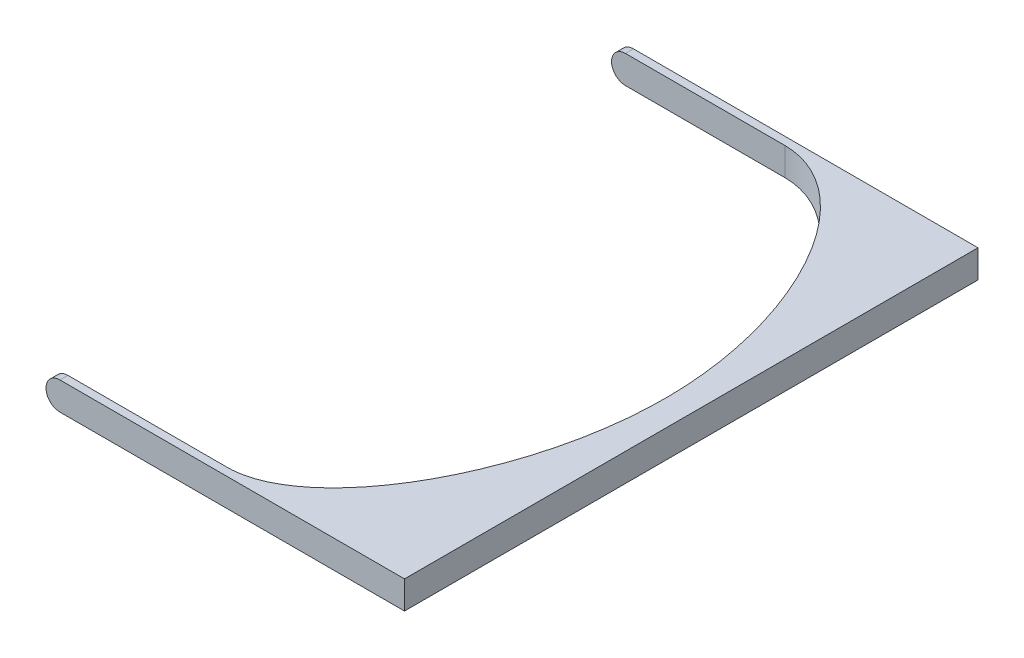
ISO-10303-21;
HEADER;
FILE_DESCRIPTION(('STEP AP214'),'2;1');
FILE_NAME('part.step','',(''),(''),'','','');
FILE_SCHEMA(('AUTOMOTIVE_DESIGN { 1 0 10303 214 1 1 1 1 }'));
ENDSEC;
DATA;
#1=APPLICATION_CONTEXT('core data for automotive mechanical design processes');
#2=APPLICATION_PROTOCOL_DEFINITION('international standard','automotive_design',2000,#1);
#3=PRODUCT_CONTEXT('',#1,'mechanical');
#4=PRODUCT('Part','Part','',(#3));
#5=PRODUCT_RELATED_PRODUCT_CATEGORY('part','',(#4));
#6=PRODUCT_DEFINITION_FORMATION('','',#4);
#7=PRODUCT_DEFINITION_CONTEXT('part definition',#1,'design');
#8=PRODUCT_DEFINITION('design','',#6,#7);
#9=PRODUCT_DEFINITION_SHAPE('','',#8);
#10=(LENGTH_UNIT() NAMED_UNIT(*) SI_UNIT(.MILLI.,.METRE.));
#11=(NAMED_UNIT(*) PLANE_ANGLE_UNIT() SI_UNIT($,.RADIAN.));
#12=(NAMED_UNIT(*) SI_UNIT($,.STERADIAN.) SOLID_ANGLE_UNIT());
#13=UNCERTAINTY_MEASURE_WITH_UNIT(LENGTH_MEASURE(1.E-05),#10,'distance_accuracy_value','');
#14=(GEOMETRIC_REPRESENTATION_CONTEXT(3) GLOBAL_UNCERTAINTY_ASSIGNED_CONTEXT((#13)) GLOBAL_UNIT_ASSIGNED_CONTEXT((#10,
#11,#12)) REPRESENTATION_CONTEXT('',''));
#15=CARTESIAN_POINT('',(0.,0.,0.));
#16=DIRECTION('',(0.,0.,1.));
#17=DIRECTION('',(1.,0.,0.));
#18=AXIS2_PLACEMENT_3D('',#15,#16,#17);
#19=CARTESIAN_POINT('',(0.,0.,-182.88));
#20=DIRECTION('',(0.,0.,1.));
#21=DIRECTION('',(1.,0.,0.));
#22=AXIS2_PLACEMENT_3D('',#19,#20,#21);
#23=CYLINDRICAL_SURFACE('',#22,8.89);
#24=DIRECTION('',(0.,0.,1.));
#25=VECTOR('',#24,1.);
#26=CARTESIAN_POINT('',(0.,-8.89,-182.88));
#27=LINE('',#26,#25);
#28=CARTESIAN_POINT('',(0.,-8.89,-182.88));
#29=VERTEX_POINT('',#28);
#30=CARTESIAN_POINT('',(0.,-8.89,-177.8));
#31=VERTEX_POINT('',#30);
#32=EDGE_CURVE('E38',#29,#31,#27,.T.);
#33=ORIENTED_EDGE('',*,*,#32,.T.);
#34=CARTESIAN_POINT('',(0.,0.,-177.8));
#35=DIRECTION('',(0.,0.,1.));
#36=DIRECTION('',(1.,0.,0.));
#37=AXIS2_PLACEMENT_3D('',#34,#35,#36);
#38=CIRCLE('',#37,8.89);
#39=CARTESIAN_POINT('',(0.,8.89,-177.8));
#40=VERTEX_POINT('',#39);
#41=EDGE_CURVE('E174',#31,#40,#38,.F.);
#42=ORIENTED_EDGE('',*,*,#41,.T.);
#43=DIRECTION('',(0.,0.,1.));
#44=VECTOR('',#43,1.);
#45=CARTESIAN_POINT('',(0.,8.89,-182.88));
#46=LINE('',#45,#44);
#47=CARTESIAN_POINT('',(0.,8.89,-182.88));
#48=VERTEX_POINT('',#47);
#49=EDGE_CURVE('E12',#48,#40,#46,.T.);
#50=ORIENTED_EDGE('',*,*,#49,.F.);
#51=CARTESIAN_POINT('',(0.,0.,-182.88));
#52=DIRECTION('',(0.,0.,1.));
#53=DIRECTION('',(1.,0.,0.));
#54=AXIS2_PLACEMENT_3D('',#51,#52,#53);
#55=CIRCLE('',#54,8.89);
#56=EDGE_CURVE('E176',#48,#29,#55,.T.);
#57=ORIENTED_EDGE('',*,*,#56,.T.);
#58=EDGE_LOOP('',(#33,#42,#50,#57));
#59=FACE_BOUND('',#58,.T.);
#60=ADVANCED_FACE('F34',(#59),#23,.T.);
#61=CARTESIAN_POINT('',(0.,8.89,-182.88));
#62=DIRECTION('',(0.,-1.,0.));
#63=DIRECTION('',(1.,0.,0.));
#64=AXIS2_PLACEMENT_3D('',#61,#62,#63);
#65=PLANE('',#64);
#66=DIRECTION('',(1.,0.,0.));
#67=VECTOR('',#66,1.);
#68=CARTESIAN_POINT('',(-101.6,8.89,-177.8));
#69=LINE('',#68,#67);
#70=CARTESIAN_POINT('',(101.6,8.89,-177.8));
#71=VERTEX_POINT('',#70);
#72=EDGE_CURVE('E120',#40,#71,#69,.T.);
#73=ORIENTED_EDGE('',*,*,#72,.T.);
#74=CARTESIAN_POINT('',(101.6,8.89,-177.8));
#75=CARTESIAN_POINT('',(152.4,8.89,-177.8));
#76=CARTESIAN_POINT('',(254.,8.89,7.728915886925E-13));
#77=CARTESIAN_POINT('',(152.4,8.89,177.8));
#78=CARTESIAN_POINT('',(101.6,8.89,177.8));
#79=B_SPLINE_CURVE_WITH_KNOTS('',3,(#74,#75,#76,#77,#78),.UNSPECIFIED.,.F.,.F.,(4,1,4),(0.,
0.499999999999999,1.),.UNSPECIFIED.);
#80=CARTESIAN_POINT('',(101.6,8.89,177.8));
#81=VERTEX_POINT('',#80);
#82=EDGE_CURVE('E106',#71,#81,#79,.T.);
#83=ORIENTED_EDGE('',*,*,#82,.T.);
#84=DIRECTION('',(1.,0.,0.));
#85=VECTOR('',#84,1.);
#86=CARTESIAN_POINT('',(-101.6,8.89,177.8));
#87=LINE('',#86,#85);
#88=CARTESIAN_POINT('',(0.,8.89,177.8));
#89=VERTEX_POINT('',#88);
#90=EDGE_CURVE('E99',#89,#81,#87,.T.);
#91=ORIENTED_EDGE('',*,*,#90,.F.);
#92=CARTESIAN_POINT('',(0.,8.89,182.88));
#93=VERTEX_POINT('',#92);
#94=EDGE_CURVE('E43',#89,#93,#46,.T.);
#95=ORIENTED_EDGE('',*,*,#94,.T.);
#96=DIRECTION('',(1.,0.,0.));
#97=VECTOR('',#96,1.);
#98=CARTESIAN_POINT('',(0.,8.89,182.88));
#99=LINE('',#98,#97);
#100=CARTESIAN_POINT('',(219.75154297,8.89,182.88));
#101=VERTEX_POINT('',#100);
#102=EDGE_CURVE('E197',#93,#101,#99,.T.);
#103=ORIENTED_EDGE('',*,*,#102,.T.);
#104=DIRECTION('',(0.,0.,1.));
#105=VECTOR('',#104,1.);
#106=CARTESIAN_POINT('',(219.75154297,8.89,-182.88));
#107=LINE('',#106,#105);
#108=CARTESIAN_POINT('',(219.75154297,8.89,-182.88));
#109=VERTEX_POINT('',#108);
#110=EDGE_CURVE('E180',#109,#101,#107,.T.);
#111=ORIENTED_EDGE('',*,*,#110,.F.);
#112=DIRECTION('',(1.,0.,0.));
#113=VECTOR('',#112,1.);
#114=CARTESIAN_POINT('',(0.,8.89,-182.88));
#115=LINE('',#114,#113);
#116=EDGE_CURVE('E181',#48,#109,#115,.T.);
#117=ORIENTED_EDGE('',*,*,#116,.F.);
#118=ORIENTED_EDGE('',*,*,#49,.T.);
#119=EDGE_LOOP('',(#73,#83,#91,#95,#103,#111,#117,#118));
#120=FACE_BOUND('',#119,.T.);
#121=ADVANCED_FACE('F119',(#120),#65,.F.);
#122=CARTESIAN_POINT('',(219.75154297,-8.88999999999997,-182.88));
#123=DIRECTION('',(0.,1.,0.));
#124=DIRECTION('',(-1.,0.,0.));
#125=AXIS2_PLACEMENT_3D('',#122,#123,#124);
#126=PLANE('',#125);
#127=DIRECTION('',(1.,0.,0.));
#128=VECTOR('',#127,1.);
#129=CARTESIAN_POINT('',(-101.6,-8.89,-177.8));
#130=LINE('',#129,#128);
#131=CARTESIAN_POINT('',(101.6,-8.89,-177.8));
#132=VERTEX_POINT('',#131);
#133=EDGE_CURVE('E117',#31,#132,#130,.T.);
#134=ORIENTED_EDGE('',*,*,#133,.F.);
#135=ORIENTED_EDGE('',*,*,#32,.F.);
#136=DIRECTION('',(-1.,0.,0.));
#137=VECTOR('',#136,1.);
#138=CARTESIAN_POINT('',(219.75154297,-8.88999999999997,-182.88));
#139=LINE('',#138,#137);
#140=CARTESIAN_POINT('',(219.75154297,-8.88999999999997,-182.88));
#141=VERTEX_POINT('',#140);
#142=EDGE_CURVE('E188',#141,#29,#139,.T.);
#143=ORIENTED_EDGE('',*,*,#142,.F.);
#144=DIRECTION('',(0.,0.,1.));
#145=VECTOR('',#144,1.);
#146=CARTESIAN_POINT('',(219.75154297,-8.88999999999997,-182.88));
#147=LINE('',#146,#145);
#148=CARTESIAN_POINT('',(219.75154297,-8.88999999999997,182.88));
#149=VERTEX_POINT('',#148);
#150=EDGE_CURVE('E178',#141,#149,#147,.T.);
#151=ORIENTED_EDGE('',*,*,#150,.T.);
#152=DIRECTION('',(-1.,0.,0.));
#153=VECTOR('',#152,1.);
#154=CARTESIAN_POINT('',(219.75154297,-8.88999999999997,182.88));
#155=LINE('',#154,#153);
#156=CARTESIAN_POINT('',(0.,-8.89,182.88));
#157=VERTEX_POINT('',#156);
#158=EDGE_CURVE('E201',#149,#157,#155,.T.);
#159=ORIENTED_EDGE('',*,*,#158,.T.);
#160=CARTESIAN_POINT('',(0.,-8.89,177.8));
#161=VERTEX_POINT('',#160);
#162=EDGE_CURVE('E179',#161,#157,#27,.T.);
#163=ORIENTED_EDGE('',*,*,#162,.F.);
#164=DIRECTION('',(1.,0.,0.));
#165=VECTOR('',#164,1.);
#166=CARTESIAN_POINT('',(-101.6,-8.89,177.8));
#167=LINE('',#166,#165);
#168=CARTESIAN_POINT('',(101.6,-8.88999999999999,177.8));
#169=VERTEX_POINT('',#168);
#170=EDGE_CURVE('E122',#161,#169,#167,.T.);
#171=ORIENTED_EDGE('',*,*,#170,.T.);
#172=CARTESIAN_POINT('',(101.6,-8.89,-177.8));
#173=CARTESIAN_POINT('',(152.4,-8.89,-177.8));
#174=CARTESIAN_POINT('',(254.,-8.89,7.728915886925E-13));
#175=CARTESIAN_POINT('',(152.4,-8.89,177.8));
#176=CARTESIAN_POINT('',(101.6,-8.89,177.8));
#177=B_SPLINE_CURVE_WITH_KNOTS('',3,(#172,#173,#174,#175,#176),.UNSPECIFIED.,.F.,.F.,(4,1,4),
(0.,0.499999999999999,1.),.UNSPECIFIED.);
#178=EDGE_CURVE('E114',#132,#169,#177,.T.);
#179=ORIENTED_EDGE('',*,*,#178,.F.);
#180=EDGE_LOOP('',(#134,#135,#143,#151,#159,#163,#171,#179));
#181=FACE_BOUND('',#180,.T.);
#182=ADVANCED_FACE('F159',(#181),#126,.F.);
#183=CARTESIAN_POINT('',(0.,0.,177.8));
#184=DIRECTION('',(0.,0.,1.));
#185=DIRECTION('',(1.,0.,0.));
#186=AXIS2_PLACEMENT_3D('',#183,#184,#185);
#187=CIRCLE('',#186,8.89);
#188=EDGE_CURVE('E102',#161,#89,#187,.F.);
#189=ORIENTED_EDGE('',*,*,#188,.F.);
#190=ORIENTED_EDGE('',*,*,#162,.T.);
#191=CARTESIAN_POINT('',(0.,0.,182.88));
#192=DIRECTION('',(0.,0.,1.));
#193=DIRECTION('',(1.,0.,0.));
#194=AXIS2_PLACEMENT_3D('',#191,#192,#193);
#195=CIRCLE('',#194,8.89);
#196=EDGE_CURVE('E198',#93,#157,#195,.T.);
#197=ORIENTED_EDGE('',*,*,#196,.F.);
#198=ORIENTED_EDGE('',*,*,#94,.F.);
#199=EDGE_LOOP('',(#189,#190,#197,#198));
#200=FACE_BOUND('',#199,.T.);
#201=ADVANCED_FACE('F36',(#200),#23,.T.);
#202=CARTESIAN_POINT('',(219.75154297,8.89,-182.88));
#203=DIRECTION('',(-1.,0.,0.));
#204=DIRECTION('',(0.,0.,1.));
#205=AXIS2_PLACEMENT_3D('',#202,#203,#204);
#206=PLANE('',#205);
#207=DIRECTION('',(0.,-1.,0.));
#208=VECTOR('',#207,1.);
#209=CARTESIAN_POINT('',(219.75154297,8.89,182.88));
#210=LINE('',#209,#208);
#211=EDGE_CURVE('E203',#101,#149,#210,.T.);
#212=ORIENTED_EDGE('',*,*,#211,.T.);
#213=ORIENTED_EDGE('',*,*,#150,.F.);
#214=DIRECTION('',(0.,-1.,0.));
#215=VECTOR('',#214,1.);
#216=CARTESIAN_POINT('',(219.75154297,8.89,-182.88));
#217=LINE('',#216,#215);
#218=EDGE_CURVE('E185',#109,#141,#217,.T.);
#219=ORIENTED_EDGE('',*,*,#218,.F.);
#220=ORIENTED_EDGE('',*,*,#110,.T.);
#221=EDGE_LOOP('',(#212,#213,#219,#220));
#222=FACE_BOUND('',#221,.T.);
#223=ADVANCED_FACE('F155',(#222),#206,.F.);
#224=CARTESIAN_POINT('',(0.,0.,-182.88));
#225=DIRECTION('',(0.,0.,1.));
#226=DIRECTION('',(1.,0.,0.));
#227=AXIS2_PLACEMENT_3D('',#224,#225,#226);
#228=PLANE('',#227);
#229=ORIENTED_EDGE('',*,*,#56,.F.);
#230=ORIENTED_EDGE('',*,*,#116,.T.);
#231=ORIENTED_EDGE('',*,*,#218,.T.);
#232=ORIENTED_EDGE('',*,*,#142,.T.);
#233=EDGE_LOOP('',(#229,#230,#231,#232));
#234=FACE_BOUND('',#233,.T.);
#235=ADVANCED_FACE('F151',(#234),#228,.F.);
#236=CARTESIAN_POINT('',(0.,0.,182.88));
#237=DIRECTION('',(0.,0.,1.));
#238=DIRECTION('',(1.,0.,0.));
#239=AXIS2_PLACEMENT_3D('',#236,#237,#238);
#240=PLANE('',#239);
#241=ORIENTED_EDGE('',*,*,#196,.T.);
#242=ORIENTED_EDGE('',*,*,#158,.F.);
#243=ORIENTED_EDGE('',*,*,#211,.F.);
#244=ORIENTED_EDGE('',*,*,#102,.F.);
#245=EDGE_LOOP('',(#241,#242,#243,#244));
#246=FACE_BOUND('',#245,.T.);
#247=ADVANCED_FACE('F143',(#246),#240,.T.);
#248=DIRECTION('',(0.,1.,0.));
#249=VECTOR('',#248,1.);
#250=SURFACE_OF_LINEAR_EXTRUSION('',#177,#249);
#251=DIRECTION('',(0.,1.,0.));
#252=VECTOR('',#251,1.);
#253=CARTESIAN_POINT('',(101.6,-8.89,-177.8));
#254=LINE('',#253,#252);
#255=EDGE_CURVE('E116',#132,#71,#254,.T.);
#256=ORIENTED_EDGE('',*,*,#255,.F.);
#257=ORIENTED_EDGE('',*,*,#178,.T.);
#258=DIRECTION('',(0.,1.,0.));
#259=VECTOR('',#258,1.);
#260=CARTESIAN_POINT('',(101.6,-8.89,177.8));
#261=LINE('',#260,#259);
#262=EDGE_CURVE('E51',#169,#81,#261,.T.);
#263=ORIENTED_EDGE('',*,*,#262,.T.);
#264=ORIENTED_EDGE('',*,*,#82,.F.);
#265=EDGE_LOOP('',(#256,#257,#263,#264));
#266=FACE_BOUND('',#265,.T.);
#267=ADVANCED_FACE('F111',(#266),#250,.T.);
#268=CARTESIAN_POINT('',(0.,0.,-177.8));
#269=DIRECTION('',(0.,0.,1.));
#270=DIRECTION('',(1.,0.,0.));
#271=AXIS2_PLACEMENT_3D('',#268,#269,#270);
#272=PLANE('',#271);
#273=ORIENTED_EDGE('',*,*,#133,.T.);
#274=ORIENTED_EDGE('',*,*,#255,.T.);
#275=ORIENTED_EDGE('',*,*,#72,.F.);
#276=ORIENTED_EDGE('',*,*,#41,.F.);
#277=EDGE_LOOP('',(#273,#274,#275,#276));
#278=FACE_BOUND('',#277,.T.);
#279=ADVANCED_FACE('F142',(#278),#272,.T.);
#280=CARTESIAN_POINT('',(0.,0.,177.8));
#281=DIRECTION('',(0.,0.,1.));
#282=DIRECTION('',(1.,0.,0.));
#283=AXIS2_PLACEMENT_3D('',#280,#281,#282);
#284=PLANE('',#283);
#285=ORIENTED_EDGE('',*,*,#188,.T.);
#286=ORIENTED_EDGE('',*,*,#90,.T.);
#287=ORIENTED_EDGE('',*,*,#262,.F.);
#288=ORIENTED_EDGE('',*,*,#170,.F.);
#289=EDGE_LOOP('',(#285,#286,#287,#288));
#290=FACE_BOUND('',#289,.T.);
#291=ADVANCED_FACE('F100',(#290),#284,.F.);
#292=CLOSED_SHELL('',(#60,#121,#182,#201,#223,#235,#247,#267,#279,#291));
#293=MANIFOLD_SOLID_BREP('B2',#292);
#294=ADVANCED_BREP_SHAPE_REPRESENTATION('',(#18,#293),#14);
#295=SHAPE_DEFINITION_REPRESENTATION(#9,#294);
ENDSEC;
END-ISO-10303-21;
